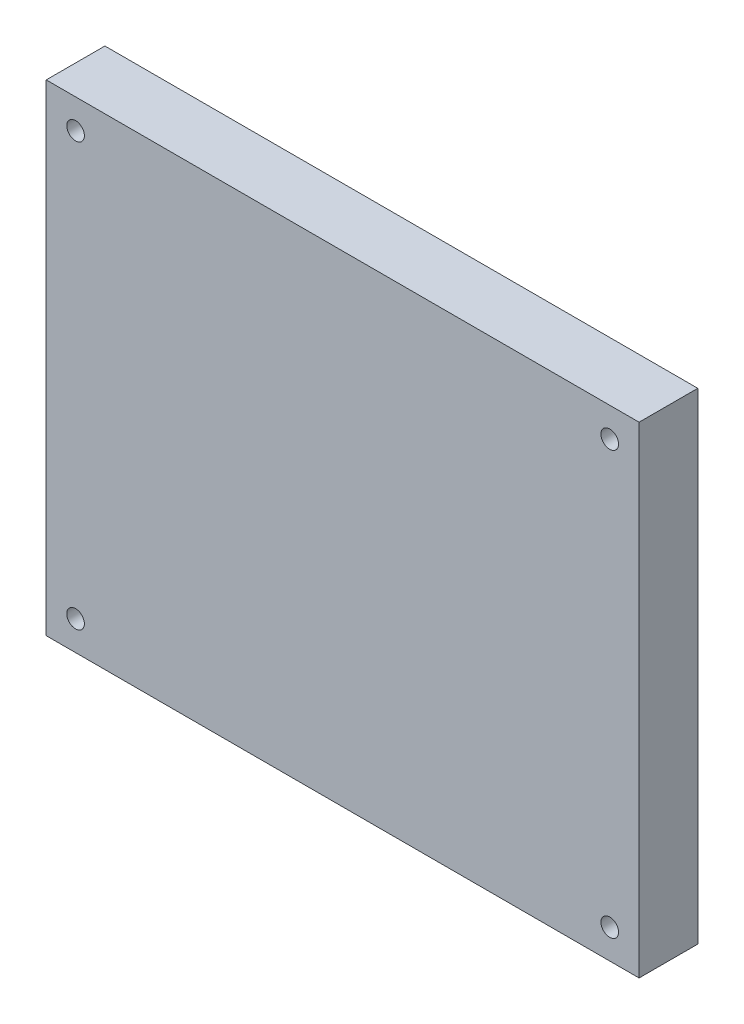
ISO-10303-21;
HEADER;
FILE_DESCRIPTION(('STEP AP214'),'2;1');
FILE_NAME('part.step','',(''),(''),'','','');
FILE_SCHEMA(('AUTOMOTIVE_DESIGN { 1 0 10303 214 1 1 1 1 }'));
ENDSEC;
DATA;
#1=APPLICATION_CONTEXT('core data for automotive mechanical design processes');
#2=APPLICATION_PROTOCOL_DEFINITION('international standard','automotive_design',2000,#1);
#3=PRODUCT_CONTEXT('',#1,'mechanical');
#4=PRODUCT('Part','Part','',(#3));
#5=PRODUCT_RELATED_PRODUCT_CATEGORY('part','',(#4));
#6=PRODUCT_DEFINITION_FORMATION('','',#4);
#7=PRODUCT_DEFINITION_CONTEXT('part definition',#1,'design');
#8=PRODUCT_DEFINITION('design','',#6,#7);
#9=PRODUCT_DEFINITION_SHAPE('','',#8);
#10=(LENGTH_UNIT() NAMED_UNIT(*) SI_UNIT(.MILLI.,.METRE.));
#11=(NAMED_UNIT(*) PLANE_ANGLE_UNIT() SI_UNIT($,.RADIAN.));
#12=(NAMED_UNIT(*) SI_UNIT($,.STERADIAN.) SOLID_ANGLE_UNIT());
#13=UNCERTAINTY_MEASURE_WITH_UNIT(LENGTH_MEASURE(1.E-05),#10,'distance_accuracy_value','');
#14=(GEOMETRIC_REPRESENTATION_CONTEXT(3) GLOBAL_UNCERTAINTY_ASSIGNED_CONTEXT((#13)) GLOBAL_UNIT_ASSIGNED_CONTEXT((#10,
#11,#12)) REPRESENTATION_CONTEXT('',''));
#15=CARTESIAN_POINT('',(0.,0.,0.));
#16=DIRECTION('',(0.,0.,1.));
#17=DIRECTION('',(1.,0.,0.));
#18=AXIS2_PLACEMENT_3D('',#15,#16,#17);
#19=CARTESIAN_POINT('',(-24.5992570677186,14.9644973544974,10.));
#20=DIRECTION('',(1.,0.,0.));
#21=DIRECTION('',(0.,1.,0.));
#22=AXIS2_PLACEMENT_3D('',#19,#20,#21);
#23=PLANE('',#22);
#24=DIRECTION('',(0.,-1.,0.));
#25=VECTOR('',#24,1.);
#26=CARTESIAN_POINT('',(-24.5992570677186,14.9644973544974,0.));
#27=LINE('',#26,#25);
#28=CARTESIAN_POINT('',(-24.5992570677186,14.9644973544974,0.));
#29=VERTEX_POINT('',#28);
#30=CARTESIAN_POINT('',(-24.5992570677186,-67.0355026455026,0.));
#31=VERTEX_POINT('',#30);
#32=EDGE_CURVE('E94',#29,#31,#27,.T.);
#33=ORIENTED_EDGE('',*,*,#32,.T.);
#34=DIRECTION('',(0.,0.,-1.));
#35=VECTOR('',#34,1.);
#36=CARTESIAN_POINT('',(-24.5992570677186,-67.0355026455026,10.));
#37=LINE('',#36,#35);
#38=CARTESIAN_POINT('',(-24.5992570677186,-67.0355026455026,10.));
#39=VERTEX_POINT('',#38);
#40=EDGE_CURVE('E11',#39,#31,#37,.T.);
#41=ORIENTED_EDGE('',*,*,#40,.F.);
#42=DIRECTION('',(0.,-1.,0.));
#43=VECTOR('',#42,1.);
#44=CARTESIAN_POINT('',(-24.5992570677186,14.9644973544974,10.));
#45=LINE('',#44,#43);
#46=CARTESIAN_POINT('',(-24.5992570677186,14.9644973544974,10.));
#47=VERTEX_POINT('',#46);
#48=EDGE_CURVE('E82',#47,#39,#45,.T.);
#49=ORIENTED_EDGE('',*,*,#48,.F.);
#50=DIRECTION('',(0.,0.,-1.));
#51=VECTOR('',#50,1.);
#52=CARTESIAN_POINT('',(-24.5992570677186,14.9644973544974,10.));
#53=LINE('',#52,#51);
#54=EDGE_CURVE('E90',#47,#29,#53,.T.);
#55=ORIENTED_EDGE('',*,*,#54,.T.);
#56=EDGE_LOOP('',(#33,#41,#49,#55));
#57=FACE_BOUND('',#56,.T.);
#58=ADVANCED_FACE('F31',(#57),#23,.F.);
#59=CARTESIAN_POINT('',(-24.5992570677186,-67.0355026455026,10.));
#60=DIRECTION('',(0.,1.,0.));
#61=DIRECTION('',(0.,0.,1.));
#62=AXIS2_PLACEMENT_3D('',#59,#60,#61);
#63=PLANE('',#62);
#64=DIRECTION('',(1.,0.,0.));
#65=VECTOR('',#64,1.);
#66=CARTESIAN_POINT('',(-24.5992570677186,-67.0355026455026,0.));
#67=LINE('',#66,#65);
#68=CARTESIAN_POINT('',(76.4007429322814,-67.0355026455026,0.));
#69=VERTEX_POINT('',#68);
#70=EDGE_CURVE('E86',#31,#69,#67,.T.);
#71=ORIENTED_EDGE('',*,*,#70,.T.);
#72=DIRECTION('',(0.,0.,-1.));
#73=VECTOR('',#72,1.);
#74=CARTESIAN_POINT('',(76.4007429322814,-67.0355026455026,10.));
#75=LINE('',#74,#73);
#76=CARTESIAN_POINT('',(76.4007429322814,-67.0355026455026,10.));
#77=VERTEX_POINT('',#76);
#78=EDGE_CURVE('E39',#77,#69,#75,.T.);
#79=ORIENTED_EDGE('',*,*,#78,.F.);
#80=DIRECTION('',(1.,0.,0.));
#81=VECTOR('',#80,1.);
#82=CARTESIAN_POINT('',(-24.5992570677186,-67.0355026455026,10.));
#83=LINE('',#82,#81);
#84=EDGE_CURVE('E77',#39,#77,#83,.T.);
#85=ORIENTED_EDGE('',*,*,#84,.F.);
#86=ORIENTED_EDGE('',*,*,#40,.T.);
#87=EDGE_LOOP('',(#71,#79,#85,#86));
#88=FACE_BOUND('',#87,.T.);
#89=ADVANCED_FACE('F85',(#88),#63,.F.);
#90=CARTESIAN_POINT('',(76.4007429322814,14.9644973544974,10.));
#91=DIRECTION('',(-1.,0.,0.));
#92=DIRECTION('',(0.,-1.,0.));
#93=AXIS2_PLACEMENT_3D('',#90,#91,#92);
#94=PLANE('',#93);
#95=DIRECTION('',(0.,1.,0.));
#96=VECTOR('',#95,1.);
#97=CARTESIAN_POINT('',(76.4007429322814,14.9644973544974,0.));
#98=LINE('',#97,#96);
#99=CARTESIAN_POINT('',(76.4007429322814,14.9644973544974,0.));
#100=VERTEX_POINT('',#99);
#101=EDGE_CURVE('E64',#69,#100,#98,.T.);
#102=ORIENTED_EDGE('',*,*,#101,.T.);
#103=DIRECTION('',(0.,0.,-1.));
#104=VECTOR('',#103,1.);
#105=CARTESIAN_POINT('',(76.4007429322814,14.9644973544974,10.));
#106=LINE('',#105,#104);
#107=CARTESIAN_POINT('',(76.4007429322814,14.9644973544974,10.));
#108=VERTEX_POINT('',#107);
#109=EDGE_CURVE('E87',#108,#100,#106,.T.);
#110=ORIENTED_EDGE('',*,*,#109,.F.);
#111=DIRECTION('',(0.,1.,0.));
#112=VECTOR('',#111,1.);
#113=CARTESIAN_POINT('',(76.4007429322814,14.9644973544974,10.));
#114=LINE('',#113,#112);
#115=EDGE_CURVE('E80',#77,#108,#114,.T.);
#116=ORIENTED_EDGE('',*,*,#115,.F.);
#117=ORIENTED_EDGE('',*,*,#78,.T.);
#118=EDGE_LOOP('',(#102,#110,#116,#117));
#119=FACE_BOUND('',#118,.T.);
#120=ADVANCED_FACE('F88',(#119),#94,.F.);
#121=CARTESIAN_POINT('',(-24.5992570677186,14.9644973544974,10.));
#122=DIRECTION('',(0.,-1.,0.));
#123=DIRECTION('',(0.,0.,-1.));
#124=AXIS2_PLACEMENT_3D('',#121,#122,#123);
#125=PLANE('',#124);
#126=DIRECTION('',(-1.,0.,0.));
#127=VECTOR('',#126,1.);
#128=CARTESIAN_POINT('',(-24.5992570677186,14.9644973544974,0.));
#129=LINE('',#128,#127);
#130=EDGE_CURVE('E70',#100,#29,#129,.T.);
#131=ORIENTED_EDGE('',*,*,#130,.T.);
#132=ORIENTED_EDGE('',*,*,#54,.F.);
#133=DIRECTION('',(-1.,0.,0.));
#134=VECTOR('',#133,1.);
#135=CARTESIAN_POINT('',(-24.5992570677186,14.9644973544974,10.));
#136=LINE('',#135,#134);
#137=EDGE_CURVE('E47',#108,#47,#136,.T.);
#138=ORIENTED_EDGE('',*,*,#137,.F.);
#139=ORIENTED_EDGE('',*,*,#109,.T.);
#140=EDGE_LOOP('',(#131,#132,#138,#139));
#141=FACE_BOUND('',#140,.T.);
#142=ADVANCED_FACE('F102',(#141),#125,.F.);
#143=CARTESIAN_POINT('',(-24.5992570677186,-67.0355026455026,10.));
#144=DIRECTION('',(0.,0.,1.));
#145=DIRECTION('',(1.,0.,0.));
#146=AXIS2_PLACEMENT_3D('',#143,#144,#145);
#147=PLANE('',#146);
#148=CARTESIAN_POINT('',(-19.5992570677186,-62.0355026455027,10.));
#149=DIRECTION('',(0.,0.,1.));
#150=DIRECTION('',(1.,0.,0.));
#151=AXIS2_PLACEMENT_3D('',#148,#149,#150);
#152=CIRCLE('',#151,1.5);
#153=CARTESIAN_POINT('',(-18.0992570677186,-62.0355026455027,10.));
#154=VERTEX_POINT('',#153);
#155=EDGE_CURVE('E126',#154,#154,#152,.T.);
#156=ORIENTED_EDGE('',*,*,#155,.F.);
#157=EDGE_LOOP('',(#156));
#158=FACE_BOUND('',#157,.T.);
#159=CARTESIAN_POINT('',(71.4007429322814,-62.0355026455027,10.));
#160=DIRECTION('',(0.,0.,1.));
#161=DIRECTION('',(1.,0.,0.));
#162=AXIS2_PLACEMENT_3D('',#159,#160,#161);
#163=CIRCLE('',#162,1.5);
#164=CARTESIAN_POINT('',(72.9007429322814,-62.0355026455027,10.));
#165=VERTEX_POINT('',#164);
#166=EDGE_CURVE('E120',#165,#165,#163,.T.);
#167=ORIENTED_EDGE('',*,*,#166,.F.);
#168=EDGE_LOOP('',(#167));
#169=FACE_BOUND('',#168,.T.);
#170=CARTESIAN_POINT('',(71.4007429322814,9.96449735449735,10.));
#171=DIRECTION('',(0.,0.,1.));
#172=DIRECTION('',(1.,0.,0.));
#173=AXIS2_PLACEMENT_3D('',#170,#171,#172);
#174=CIRCLE('',#173,1.5);
#175=CARTESIAN_POINT('',(72.9007429322814,9.96449735449735,10.));
#176=VERTEX_POINT('',#175);
#177=EDGE_CURVE('E114',#176,#176,#174,.T.);
#178=ORIENTED_EDGE('',*,*,#177,.F.);
#179=EDGE_LOOP('',(#178));
#180=FACE_BOUND('',#179,.T.);
#181=CARTESIAN_POINT('',(-19.5992570677186,9.96449735449735,10.));
#182=DIRECTION('',(0.,0.,1.));
#183=DIRECTION('',(1.,0.,0.));
#184=AXIS2_PLACEMENT_3D('',#181,#182,#183);
#185=CIRCLE('',#184,1.5);
#186=CARTESIAN_POINT('',(-18.0992570677186,9.96449735449735,10.));
#187=VERTEX_POINT('',#186);
#188=EDGE_CURVE('E108',#187,#187,#185,.T.);
#189=ORIENTED_EDGE('',*,*,#188,.F.);
#190=EDGE_LOOP('',(#189));
#191=FACE_BOUND('',#190,.T.);
#192=ORIENTED_EDGE('',*,*,#48,.T.);
#193=ORIENTED_EDGE('',*,*,#84,.T.);
#194=ORIENTED_EDGE('',*,*,#115,.T.);
#195=ORIENTED_EDGE('',*,*,#137,.T.);
#196=EDGE_LOOP('',(#192,#193,#194,#195));
#197=FACE_BOUND('',#196,.T.);
#198=ADVANCED_FACE('F78',(#158,#169,#180,#191,#197),#147,.T.);
#199=CARTESIAN_POINT('',(-24.5992570677186,-67.0355026455026,0.));
#200=DIRECTION('',(0.,0.,1.));
#201=DIRECTION('',(1.,0.,0.));
#202=AXIS2_PLACEMENT_3D('',#199,#200,#201);
#203=PLANE('',#202);
#204=CARTESIAN_POINT('',(-19.5992570677186,-62.0355026455027,0.));
#205=DIRECTION('',(0.,0.,1.));
#206=DIRECTION('',(1.,0.,0.));
#207=AXIS2_PLACEMENT_3D('',#204,#205,#206);
#208=CIRCLE('',#207,1.5);
#209=CARTESIAN_POINT('',(-18.0992570677186,-62.0355026455027,0.));
#210=VERTEX_POINT('',#209);
#211=EDGE_CURVE('E123',#210,#210,#208,.T.);
#212=ORIENTED_EDGE('',*,*,#211,.T.);
#213=EDGE_LOOP('',(#212));
#214=FACE_BOUND('',#213,.T.);
#215=CARTESIAN_POINT('',(71.4007429322814,-62.0355026455027,0.));
#216=DIRECTION('',(0.,0.,1.));
#217=DIRECTION('',(1.,0.,0.));
#218=AXIS2_PLACEMENT_3D('',#215,#216,#217);
#219=CIRCLE('',#218,1.5);
#220=CARTESIAN_POINT('',(72.9007429322814,-62.0355026455027,0.));
#221=VERTEX_POINT('',#220);
#222=EDGE_CURVE('E117',#221,#221,#219,.T.);
#223=ORIENTED_EDGE('',*,*,#222,.T.);
#224=EDGE_LOOP('',(#223));
#225=FACE_BOUND('',#224,.T.);
#226=CARTESIAN_POINT('',(71.4007429322814,9.96449735449735,0.));
#227=DIRECTION('',(0.,0.,1.));
#228=DIRECTION('',(1.,0.,0.));
#229=AXIS2_PLACEMENT_3D('',#226,#227,#228);
#230=CIRCLE('',#229,1.5);
#231=CARTESIAN_POINT('',(72.9007429322814,9.96449735449735,0.));
#232=VERTEX_POINT('',#231);
#233=EDGE_CURVE('E111',#232,#232,#230,.T.);
#234=ORIENTED_EDGE('',*,*,#233,.T.);
#235=EDGE_LOOP('',(#234));
#236=FACE_BOUND('',#235,.T.);
#237=CARTESIAN_POINT('',(-19.5992570677186,9.96449735449735,0.));
#238=DIRECTION('',(0.,0.,1.));
#239=DIRECTION('',(1.,0.,0.));
#240=AXIS2_PLACEMENT_3D('',#237,#238,#239);
#241=CIRCLE('',#240,1.5);
#242=CARTESIAN_POINT('',(-18.0992570677186,9.96449735449735,0.));
#243=VERTEX_POINT('',#242);
#244=EDGE_CURVE('E97',#243,#243,#241,.T.);
#245=ORIENTED_EDGE('',*,*,#244,.T.);
#246=EDGE_LOOP('',(#245));
#247=FACE_BOUND('',#246,.T.);
#248=ORIENTED_EDGE('',*,*,#32,.F.);
#249=ORIENTED_EDGE('',*,*,#130,.F.);
#250=ORIENTED_EDGE('',*,*,#101,.F.);
#251=ORIENTED_EDGE('',*,*,#70,.F.);
#252=EDGE_LOOP('',(#248,#249,#250,#251));
#253=FACE_BOUND('',#252,.T.);
#254=ADVANCED_FACE('F105',(#214,#225,#236,#247,#253),#203,.F.);
#255=CARTESIAN_POINT('',(-19.5992570677186,9.96449735449735,0.));
#256=DIRECTION('',(0.,0.,1.));
#257=DIRECTION('',(1.,0.,0.));
#258=AXIS2_PLACEMENT_3D('',#255,#256,#257);
#259=CYLINDRICAL_SURFACE('',#258,1.5);
#260=ORIENTED_EDGE('',*,*,#244,.F.);
#261=EDGE_LOOP('',(#260));
#262=FACE_BOUND('',#261,.T.);
#263=ORIENTED_EDGE('',*,*,#188,.T.);
#264=EDGE_LOOP('',(#263));
#265=FACE_BOUND('',#264,.T.);
#266=ADVANCED_FACE('F150',(#262,#265),#259,.F.);
#267=CARTESIAN_POINT('',(71.4007429322814,9.96449735449735,0.));
#268=DIRECTION('',(0.,0.,1.));
#269=DIRECTION('',(1.,0.,0.));
#270=AXIS2_PLACEMENT_3D('',#267,#268,#269);
#271=CYLINDRICAL_SURFACE('',#270,1.5);
#272=ORIENTED_EDGE('',*,*,#233,.F.);
#273=EDGE_LOOP('',(#272));
#274=FACE_BOUND('',#273,.T.);
#275=ORIENTED_EDGE('',*,*,#177,.T.);
#276=EDGE_LOOP('',(#275));
#277=FACE_BOUND('',#276,.T.);
#278=ADVANCED_FACE('F152',(#274,#277),#271,.F.);
#279=CARTESIAN_POINT('',(71.4007429322814,-62.0355026455027,0.));
#280=DIRECTION('',(0.,0.,1.));
#281=DIRECTION('',(1.,0.,0.));
#282=AXIS2_PLACEMENT_3D('',#279,#280,#281);
#283=CYLINDRICAL_SURFACE('',#282,1.5);
#284=ORIENTED_EDGE('',*,*,#222,.F.);
#285=EDGE_LOOP('',(#284));
#286=FACE_BOUND('',#285,.T.);
#287=ORIENTED_EDGE('',*,*,#166,.T.);
#288=EDGE_LOOP('',(#287));
#289=FACE_BOUND('',#288,.T.);
#290=ADVANCED_FACE('F137',(#286,#289),#283,.F.);
#291=CARTESIAN_POINT('',(-19.5992570677186,-62.0355026455027,0.));
#292=DIRECTION('',(0.,0.,1.));
#293=DIRECTION('',(1.,0.,0.));
#294=AXIS2_PLACEMENT_3D('',#291,#292,#293);
#295=CYLINDRICAL_SURFACE('',#294,1.5);
#296=ORIENTED_EDGE('',*,*,#211,.F.);
#297=EDGE_LOOP('',(#296));
#298=FACE_BOUND('',#297,.T.);
#299=ORIENTED_EDGE('',*,*,#155,.T.);
#300=EDGE_LOOP('',(#299));
#301=FACE_BOUND('',#300,.T.);
#302=ADVANCED_FACE('F134',(#298,#301),#295,.F.);
#303=CLOSED_SHELL('',(#58,#89,#120,#142,#198,#254,#266,#278,#290,#302));
#304=MANIFOLD_SOLID_BREP('B2',#303);
#305=ADVANCED_BREP_SHAPE_REPRESENTATION('',(#18,#304),#14);
#306=SHAPE_DEFINITION_REPRESENTATION(#9,#305);
ENDSEC;
END-ISO-10303-21;
